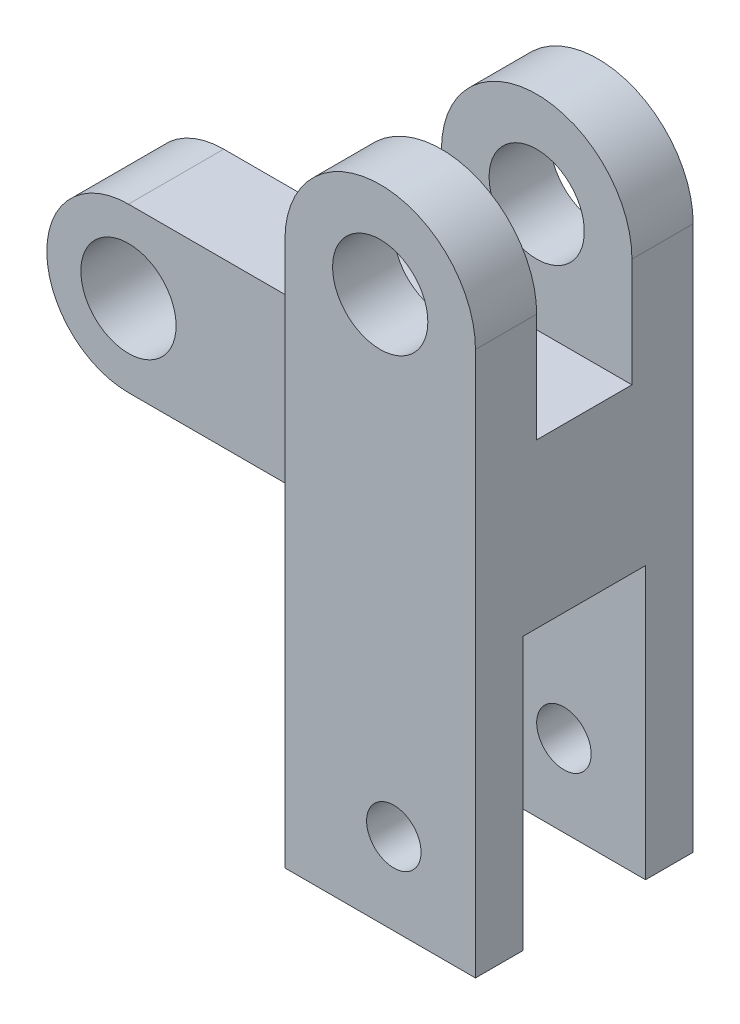
ISO-10303-21;
HEADER;
FILE_DESCRIPTION(('STEP AP214'),'2;1');
FILE_NAME('part.step','',(''),(''),'','','');
FILE_SCHEMA(('AUTOMOTIVE_DESIGN { 1 0 10303 214 1 1 1 1 }'));
ENDSEC;
DATA;
#1=APPLICATION_CONTEXT('core data for automotive mechanical design processes');
#2=APPLICATION_PROTOCOL_DEFINITION('international standard','automotive_design',2000,#1);
#3=PRODUCT_CONTEXT('',#1,'mechanical');
#4=PRODUCT('Part','Part','',(#3));
#5=PRODUCT_RELATED_PRODUCT_CATEGORY('part','',(#4));
#6=PRODUCT_DEFINITION_FORMATION('','',#4);
#7=PRODUCT_DEFINITION_CONTEXT('part definition',#1,'design');
#8=PRODUCT_DEFINITION('design','',#6,#7);
#9=PRODUCT_DEFINITION_SHAPE('','',#8);
#10=(LENGTH_UNIT() NAMED_UNIT(*) SI_UNIT(.MILLI.,.METRE.));
#11=(NAMED_UNIT(*) PLANE_ANGLE_UNIT() SI_UNIT($,.RADIAN.));
#12=(NAMED_UNIT(*) SI_UNIT($,.STERADIAN.) SOLID_ANGLE_UNIT());
#13=UNCERTAINTY_MEASURE_WITH_UNIT(LENGTH_MEASURE(1.E-05),#10,'distance_accuracy_value','');
#14=(GEOMETRIC_REPRESENTATION_CONTEXT(3) GLOBAL_UNCERTAINTY_ASSIGNED_CONTEXT((#13)) GLOBAL_UNIT_ASSIGNED_CONTEXT((#10,
#11,#12)) REPRESENTATION_CONTEXT('',''));
#15=CARTESIAN_POINT('',(0.,0.,0.));
#16=DIRECTION('',(0.,0.,1.));
#17=DIRECTION('',(1.,0.,0.));
#18=AXIS2_PLACEMENT_3D('',#15,#16,#17);
#19=CARTESIAN_POINT('',(0.,2.4,-3.5));
#20=DIRECTION('',(1.,0.,0.));
#21=DIRECTION('',(0.,0.,-1.));
#22=AXIS2_PLACEMENT_3D('',#19,#20,#21);
#23=PLANE('',#22);
#24=DIRECTION('',(0.,-1.,0.));
#25=VECTOR('',#24,1.);
#26=CARTESIAN_POINT('',(0.,3.,2.25));
#27=LINE('',#26,#25);
#28=CARTESIAN_POINT('',(0.,3.,2.25));
#29=VERTEX_POINT('',#28);
#30=CARTESIAN_POINT('',(0.,-7.,2.25));
#31=VERTEX_POINT('',#30);
#32=EDGE_CURVE('E224',#29,#31,#27,.T.);
#33=ORIENTED_EDGE('',*,*,#32,.T.);
#34=DIRECTION('',(0.,0.,-1.));
#35=VECTOR('',#34,1.);
#36=CARTESIAN_POINT('',(0.,-7.,3.5));
#37=LINE('',#36,#35);
#38=CARTESIAN_POINT('',(0.,-7.,4.));
#39=VERTEX_POINT('',#38);
#40=EDGE_CURVE('E264',#39,#31,#37,.T.);
#41=ORIENTED_EDGE('',*,*,#40,.F.);
#42=DIRECTION('',(0.,-1.,0.));
#43=VECTOR('',#42,1.);
#44=CARTESIAN_POINT('',(0.,13.,4.));
#45=LINE('',#44,#43);
#46=CARTESIAN_POINT('',(0.,13.,4.));
#47=VERTEX_POINT('',#46);
#48=EDGE_CURVE('E206',#47,#39,#45,.T.);
#49=ORIENTED_EDGE('',*,*,#48,.F.);
#50=DIRECTION('',(0.,0.,1.));
#51=VECTOR('',#50,1.);
#52=CARTESIAN_POINT('',(0.,13.,1.75));
#53=LINE('',#52,#51);
#54=CARTESIAN_POINT('',(0.,13.,1.75));
#55=VERTEX_POINT('',#54);
#56=EDGE_CURVE('E280',#55,#47,#53,.T.);
#57=ORIENTED_EDGE('',*,*,#56,.F.);
#58=DIRECTION('',(0.,1.,0.));
#59=VECTOR('',#58,1.);
#60=CARTESIAN_POINT('',(0.,0.,1.75));
#61=LINE('',#60,#59);
#62=CARTESIAN_POINT('',(0.,9.,1.75));
#63=VERTEX_POINT('',#62);
#64=EDGE_CURVE('E271',#63,#55,#61,.T.);
#65=ORIENTED_EDGE('',*,*,#64,.F.);
#66=CARTESIAN_POINT('',(0.,3.,1.75));
#67=VERTEX_POINT('',#66);
#68=EDGE_CURVE('E273',#67,#63,#61,.T.);
#69=ORIENTED_EDGE('',*,*,#68,.F.);
#70=DIRECTION('',(0.,0.,1.));
#71=VECTOR('',#70,1.);
#72=CARTESIAN_POINT('',(0.,3.,2.25));
#73=LINE('',#72,#71);
#74=EDGE_CURVE('E213',#67,#29,#73,.T.);
#75=ORIENTED_EDGE('',*,*,#74,.T.);
#76=EDGE_LOOP('',(#33,#41,#49,#57,#65,#69,#75));
#77=FACE_BOUND('',#76,.T.);
#78=ADVANCED_FACE('F45',(#77),#23,.F.);
#79=DIRECTION('',(0.,-1.,0.));
#80=VECTOR('',#79,1.);
#81=CARTESIAN_POINT('',(0.,3.,-2.25));
#82=LINE('',#81,#80);
#83=CARTESIAN_POINT('',(0.,3.,-2.25));
#84=VERTEX_POINT('',#83);
#85=CARTESIAN_POINT('',(0.,-7.,-2.25));
#86=VERTEX_POINT('',#85);
#87=EDGE_CURVE('E61',#84,#86,#82,.T.);
#88=ORIENTED_EDGE('',*,*,#87,.F.);
#89=CARTESIAN_POINT('',(0.,3.,-1.75));
#90=VERTEX_POINT('',#89);
#91=EDGE_CURVE('E210',#84,#90,#73,.T.);
#92=ORIENTED_EDGE('',*,*,#91,.T.);
#93=DIRECTION('',(0.,1.,0.));
#94=VECTOR('',#93,1.);
#95=CARTESIAN_POINT('',(0.,0.,-1.75));
#96=LINE('',#95,#94);
#97=CARTESIAN_POINT('',(0.,9.,-1.75));
#98=VERTEX_POINT('',#97);
#99=EDGE_CURVE('E284',#90,#98,#96,.T.);
#100=ORIENTED_EDGE('',*,*,#99,.T.);
#101=CARTESIAN_POINT('',(0.,13.,-1.75));
#102=VERTEX_POINT('',#101);
#103=EDGE_CURVE('E282',#98,#102,#96,.T.);
#104=ORIENTED_EDGE('',*,*,#103,.T.);
#105=DIRECTION('',(0.,0.,-1.));
#106=VECTOR('',#105,1.);
#107=CARTESIAN_POINT('',(0.,13.,-1.75));
#108=LINE('',#107,#106);
#109=CARTESIAN_POINT('',(0.,13.,-4.));
#110=VERTEX_POINT('',#109);
#111=EDGE_CURVE('E164',#102,#110,#108,.T.);
#112=ORIENTED_EDGE('',*,*,#111,.T.);
#113=DIRECTION('',(0.,1.,0.));
#114=VECTOR('',#113,1.);
#115=CARTESIAN_POINT('',(0.,-7.,-4.));
#116=LINE('',#115,#114);
#117=CARTESIAN_POINT('',(0.,-7.,-4.));
#118=VERTEX_POINT('',#117);
#119=EDGE_CURVE('E181',#118,#110,#116,.T.);
#120=ORIENTED_EDGE('',*,*,#119,.F.);
#121=EDGE_CURVE('E263',#86,#118,#37,.T.);
#122=ORIENTED_EDGE('',*,*,#121,.F.);
#123=EDGE_LOOP('',(#88,#92,#100,#104,#112,#120,#122));
#124=FACE_BOUND('',#123,.T.);
#125=ADVANCED_FACE('F356',(#124),#23,.F.);
#126=CARTESIAN_POINT('',(7.,2.4,-3.5));
#127=DIRECTION('',(-1.,0.,0.));
#128=DIRECTION('',(0.,0.,1.));
#129=AXIS2_PLACEMENT_3D('',#126,#127,#128);
#130=PLANE('',#129);
#131=DIRECTION('',(0.,-1.,0.));
#132=VECTOR('',#131,1.);
#133=CARTESIAN_POINT('',(7.,3.,-2.25));
#134=LINE('',#133,#132);
#135=CARTESIAN_POINT('',(7.,3.,-2.25));
#136=VERTEX_POINT('',#135);
#137=CARTESIAN_POINT('',(7.,-7.,-2.25));
#138=VERTEX_POINT('',#137);
#139=EDGE_CURVE('E221',#136,#138,#134,.T.);
#140=ORIENTED_EDGE('',*,*,#139,.T.);
#141=DIRECTION('',(0.,0.,1.));
#142=VECTOR('',#141,1.);
#143=CARTESIAN_POINT('',(7.,-7.,-3.5));
#144=LINE('',#143,#142);
#145=CARTESIAN_POINT('',(7.,-7.,-4.));
#146=VERTEX_POINT('',#145);
#147=EDGE_CURVE('E171',#146,#138,#144,.T.);
#148=ORIENTED_EDGE('',*,*,#147,.F.);
#149=DIRECTION('',(0.,-1.,0.));
#150=VECTOR('',#149,1.);
#151=CARTESIAN_POINT('',(7.,13.,-4.));
#152=LINE('',#151,#150);
#153=CARTESIAN_POINT('',(7.,13.,-4.));
#154=VERTEX_POINT('',#153);
#155=EDGE_CURVE('E167',#154,#146,#152,.T.);
#156=ORIENTED_EDGE('',*,*,#155,.F.);
#157=DIRECTION('',(0.,0.,-1.));
#158=VECTOR('',#157,1.);
#159=CARTESIAN_POINT('',(7.,13.,-1.75));
#160=LINE('',#159,#158);
#161=CARTESIAN_POINT('',(7.,13.,-1.75));
#162=VERTEX_POINT('',#161);
#163=EDGE_CURVE('E53',#162,#154,#160,.T.);
#164=ORIENTED_EDGE('',*,*,#163,.F.);
#165=DIRECTION('',(0.,-1.,0.));
#166=VECTOR('',#165,1.);
#167=CARTESIAN_POINT('',(7.,0.,-1.75));
#168=LINE('',#167,#166);
#169=CARTESIAN_POINT('',(7.,9.,-1.75));
#170=VERTEX_POINT('',#169);
#171=EDGE_CURVE('E286',#162,#170,#168,.T.);
#172=ORIENTED_EDGE('',*,*,#171,.T.);
#173=DIRECTION('',(0.,0.,-1.));
#174=VECTOR('',#173,1.);
#175=CARTESIAN_POINT('',(7.,9.,1.75));
#176=LINE('',#175,#174);
#177=CARTESIAN_POINT('',(7.,9.,1.75));
#178=VERTEX_POINT('',#177);
#179=EDGE_CURVE('E255',#178,#170,#176,.T.);
#180=ORIENTED_EDGE('',*,*,#179,.F.);
#181=DIRECTION('',(0.,-1.,0.));
#182=VECTOR('',#181,1.);
#183=CARTESIAN_POINT('',(7.,0.,1.75));
#184=LINE('',#183,#182);
#185=CARTESIAN_POINT('',(7.,13.,1.75));
#186=VERTEX_POINT('',#185);
#187=EDGE_CURVE('E276',#186,#178,#184,.T.);
#188=ORIENTED_EDGE('',*,*,#187,.F.);
#189=DIRECTION('',(0.,0.,1.));
#190=VECTOR('',#189,1.);
#191=CARTESIAN_POINT('',(7.,13.,1.75));
#192=LINE('',#191,#190);
#193=CARTESIAN_POINT('',(7.,13.,4.));
#194=VERTEX_POINT('',#193);
#195=EDGE_CURVE('E278',#186,#194,#192,.T.);
#196=ORIENTED_EDGE('',*,*,#195,.T.);
#197=DIRECTION('',(0.,1.,0.));
#198=VECTOR('',#197,1.);
#199=CARTESIAN_POINT('',(7.,-7.,4.));
#200=LINE('',#199,#198);
#201=CARTESIAN_POINT('',(7.,-7.,4.));
#202=VERTEX_POINT('',#201);
#203=EDGE_CURVE('E200',#202,#194,#200,.T.);
#204=ORIENTED_EDGE('',*,*,#203,.F.);
#205=CARTESIAN_POINT('',(7.,-7.,2.25));
#206=VERTEX_POINT('',#205);
#207=EDGE_CURVE('E261',#206,#202,#144,.T.);
#208=ORIENTED_EDGE('',*,*,#207,.F.);
#209=DIRECTION('',(0.,-1.,0.));
#210=VECTOR('',#209,1.);
#211=CARTESIAN_POINT('',(7.,3.,2.25));
#212=LINE('',#211,#210);
#213=CARTESIAN_POINT('',(7.,3.,2.25));
#214=VERTEX_POINT('',#213);
#215=EDGE_CURVE('E69',#214,#206,#212,.T.);
#216=ORIENTED_EDGE('',*,*,#215,.F.);
#217=DIRECTION('',(0.,0.,-1.));
#218=VECTOR('',#217,1.);
#219=CARTESIAN_POINT('',(7.,3.,1.75));
#220=LINE('',#219,#218);
#221=EDGE_CURVE('E257',#214,#136,#220,.T.);
#222=ORIENTED_EDGE('',*,*,#221,.T.);
#223=EDGE_LOOP('',(#140,#148,#156,#164,#172,#180,#188,#196,#204,#208,#216,#222));
#224=FACE_BOUND('',#223,.T.);
#225=ADVANCED_FACE('F169',(#224),#130,.F.);
#226=CARTESIAN_POINT('',(0.,-7.,0.));
#227=DIRECTION('',(0.,-1.,0.));
#228=DIRECTION('',(0.,0.,-1.));
#229=AXIS2_PLACEMENT_3D('',#226,#227,#228);
#230=PLANE('',#229);
#231=ORIENTED_EDGE('',*,*,#40,.T.);
#232=DIRECTION('',(1.,0.,0.));
#233=VECTOR('',#232,1.);
#234=CARTESIAN_POINT('',(0.,-7.,2.25));
#235=LINE('',#234,#233);
#236=EDGE_CURVE('E209',#31,#206,#235,.T.);
#237=ORIENTED_EDGE('',*,*,#236,.T.);
#238=ORIENTED_EDGE('',*,*,#207,.T.);
#239=DIRECTION('',(1.,0.,0.));
#240=VECTOR('',#239,1.);
#241=CARTESIAN_POINT('',(0.,-7.,4.));
#242=LINE('',#241,#240);
#243=EDGE_CURVE('E197',#39,#202,#242,.T.);
#244=ORIENTED_EDGE('',*,*,#243,.F.);
#245=EDGE_LOOP('',(#231,#237,#238,#244));
#246=FACE_BOUND('',#245,.T.);
#247=ADVANCED_FACE('F312',(#246),#230,.T.);
#248=ORIENTED_EDGE('',*,*,#147,.T.);
#249=DIRECTION('',(-1.,0.,0.));
#250=VECTOR('',#249,1.);
#251=CARTESIAN_POINT('',(0.,-7.,-2.25));
#252=LINE('',#251,#250);
#253=EDGE_CURVE('E218',#138,#86,#252,.T.);
#254=ORIENTED_EDGE('',*,*,#253,.T.);
#255=ORIENTED_EDGE('',*,*,#121,.T.);
#256=DIRECTION('',(-1.,0.,0.));
#257=VECTOR('',#256,1.);
#258=CARTESIAN_POINT('',(7.,-7.,-4.));
#259=LINE('',#258,#257);
#260=EDGE_CURVE('E175',#146,#118,#259,.T.);
#261=ORIENTED_EDGE('',*,*,#260,.F.);
#262=EDGE_LOOP('',(#248,#254,#255,#261));
#263=FACE_BOUND('',#262,.T.);
#264=ADVANCED_FACE('F358',(#263),#230,.T.);
#265=CARTESIAN_POINT('',(4.,-4.,-3.5));
#266=DIRECTION('',(0.,0.,1.));
#267=DIRECTION('',(1.,0.,0.));
#268=AXIS2_PLACEMENT_3D('',#265,#266,#267);
#269=CYLINDRICAL_SURFACE('',#268,1.);
#270=CARTESIAN_POINT('',(4.,-4.,2.25));
#271=DIRECTION('',(0.,0.,-1.));
#272=DIRECTION('',(-1.,0.,0.));
#273=AXIS2_PLACEMENT_3D('',#270,#271,#272);
#274=CIRCLE('',#273,1.);
#275=CARTESIAN_POINT('',(3.,-4.,2.25));
#276=VERTEX_POINT('',#275);
#277=EDGE_CURVE('E48',#276,#276,#274,.T.);
#278=ORIENTED_EDGE('',*,*,#277,.T.);
#279=EDGE_LOOP('',(#278));
#280=FACE_BOUND('',#279,.T.);
#281=CARTESIAN_POINT('',(4.,-4.,4.));
#282=DIRECTION('',(0.,0.,1.));
#283=DIRECTION('',(1.,0.,0.));
#284=AXIS2_PLACEMENT_3D('',#281,#282,#283);
#285=CIRCLE('',#284,1.);
#286=CARTESIAN_POINT('',(5.,-4.,4.));
#287=VERTEX_POINT('',#286);
#288=EDGE_CURVE('E194',#287,#287,#285,.T.);
#289=ORIENTED_EDGE('',*,*,#288,.T.);
#290=EDGE_LOOP('',(#289));
#291=FACE_BOUND('',#290,.T.);
#292=ADVANCED_FACE('F296',(#280,#291),#269,.F.);
#293=CARTESIAN_POINT('',(4.,-4.,-2.25));
#294=DIRECTION('',(0.,0.,1.));
#295=DIRECTION('',(1.,0.,0.));
#296=AXIS2_PLACEMENT_3D('',#293,#294,#295);
#297=CIRCLE('',#296,1.);
#298=CARTESIAN_POINT('',(5.,-4.,-2.25));
#299=VERTEX_POINT('',#298);
#300=EDGE_CURVE('E227',#299,#299,#297,.T.);
#301=ORIENTED_EDGE('',*,*,#300,.T.);
#302=EDGE_LOOP('',(#301));
#303=FACE_BOUND('',#302,.T.);
#304=CARTESIAN_POINT('',(4.,-4.,-4.));
#305=DIRECTION('',(0.,0.,-1.));
#306=DIRECTION('',(-1.,0.,0.));
#307=AXIS2_PLACEMENT_3D('',#304,#305,#306);
#308=CIRCLE('',#307,0.999999999999997);
#309=CARTESIAN_POINT('',(3.,-4.,-4.));
#310=VERTEX_POINT('',#309);
#311=EDGE_CURVE('E182',#310,#310,#308,.T.);
#312=ORIENTED_EDGE('',*,*,#311,.T.);
#313=EDGE_LOOP('',(#312));
#314=FACE_BOUND('',#313,.T.);
#315=ADVANCED_FACE('F366',(#303,#314),#269,.F.);
#316=CARTESIAN_POINT('',(3.5,13.,-1.75));
#317=DIRECTION('',(0.,0.,-1.));
#318=DIRECTION('',(-1.,0.,0.));
#319=AXIS2_PLACEMENT_3D('',#316,#317,#318);
#320=CYLINDRICAL_SURFACE('',#319,3.5);
#321=ORIENTED_EDGE('',*,*,#163,.T.);
#322=CARTESIAN_POINT('',(3.5,13.,-4.));
#323=DIRECTION('',(0.,0.,-1.));
#324=DIRECTION('',(-1.,0.,0.));
#325=AXIS2_PLACEMENT_3D('',#322,#323,#324);
#326=CIRCLE('',#325,3.5);
#327=EDGE_CURVE('E158',#110,#154,#326,.T.);
#328=ORIENTED_EDGE('',*,*,#327,.F.);
#329=ORIENTED_EDGE('',*,*,#111,.F.);
#330=CARTESIAN_POINT('',(3.5,13.,-1.75));
#331=DIRECTION('',(0.,0.,-1.));
#332=DIRECTION('',(-1.,0.,0.));
#333=AXIS2_PLACEMENT_3D('',#330,#331,#332);
#334=CIRCLE('',#333,3.5);
#335=EDGE_CURVE('E160',#102,#162,#334,.T.);
#336=ORIENTED_EDGE('',*,*,#335,.T.);
#337=EDGE_LOOP('',(#321,#328,#329,#336));
#338=FACE_BOUND('',#337,.T.);
#339=ADVANCED_FACE('F155',(#338),#320,.T.);
#340=CARTESIAN_POINT('',(0.,0.,-1.75));
#341=DIRECTION('',(0.,0.,-1.));
#342=DIRECTION('',(-1.,0.,0.));
#343=AXIS2_PLACEMENT_3D('',#340,#341,#342);
#344=PLANE('',#343);
#345=CARTESIAN_POINT('',(3.5,13.,-1.75));
#346=DIRECTION('',(0.,0.,-1.));
#347=DIRECTION('',(-1.,0.,0.));
#348=AXIS2_PLACEMENT_3D('',#345,#346,#347);
#349=CIRCLE('',#348,1.75);
#350=CARTESIAN_POINT('',(1.75,13.,-1.75));
#351=VERTEX_POINT('',#350);
#352=EDGE_CURVE('E268',#351,#351,#349,.T.);
#353=ORIENTED_EDGE('',*,*,#352,.T.);
#354=EDGE_LOOP('',(#353));
#355=FACE_BOUND('',#354,.T.);
#356=ORIENTED_EDGE('',*,*,#103,.F.);
#357=DIRECTION('',(1.,0.,0.));
#358=VECTOR('',#357,1.);
#359=CARTESIAN_POINT('',(0.,9.,-1.75));
#360=LINE('',#359,#358);
#361=EDGE_CURVE('E251',#98,#170,#360,.T.);
#362=ORIENTED_EDGE('',*,*,#361,.T.);
#363=ORIENTED_EDGE('',*,*,#171,.F.);
#364=ORIENTED_EDGE('',*,*,#335,.F.);
#365=EDGE_LOOP('',(#356,#362,#363,#364));
#366=FACE_BOUND('',#365,.T.);
#367=ADVANCED_FACE('F336',(#355,#366),#344,.F.);
#368=CARTESIAN_POINT('',(3.5,13.,1.75));
#369=DIRECTION('',(0.,0.,1.));
#370=DIRECTION('',(1.,0.,0.));
#371=AXIS2_PLACEMENT_3D('',#368,#369,#370);
#372=CYLINDRICAL_SURFACE('',#371,3.5);
#373=ORIENTED_EDGE('',*,*,#56,.T.);
#374=CARTESIAN_POINT('',(3.5,13.,4.));
#375=DIRECTION('',(0.,0.,1.));
#376=DIRECTION('',(1.,0.,0.));
#377=AXIS2_PLACEMENT_3D('',#374,#375,#376);
#378=CIRCLE('',#377,3.5);
#379=EDGE_CURVE('E203',#194,#47,#378,.T.);
#380=ORIENTED_EDGE('',*,*,#379,.F.);
#381=ORIENTED_EDGE('',*,*,#195,.F.);
#382=CARTESIAN_POINT('',(3.5,13.,1.75));
#383=DIRECTION('',(0.,0.,-1.));
#384=DIRECTION('',(-1.,0.,0.));
#385=AXIS2_PLACEMENT_3D('',#382,#383,#384);
#386=CIRCLE('',#385,3.5);
#387=EDGE_CURVE('E274',#55,#186,#386,.T.);
#388=ORIENTED_EDGE('',*,*,#387,.F.);
#389=EDGE_LOOP('',(#373,#380,#381,#388));
#390=FACE_BOUND('',#389,.T.);
#391=ADVANCED_FACE('F322',(#390),#372,.T.);
#392=CARTESIAN_POINT('',(0.,0.,1.75));
#393=DIRECTION('',(0.,0.,-1.));
#394=DIRECTION('',(-1.,0.,0.));
#395=AXIS2_PLACEMENT_3D('',#392,#393,#394);
#396=PLANE('',#395);
#397=DIRECTION('',(1.,0.,0.));
#398=VECTOR('',#397,1.);
#399=CARTESIAN_POINT('',(0.,9.,1.75));
#400=LINE('',#399,#398);
#401=EDGE_CURVE('E12',#63,#178,#400,.T.);
#402=ORIENTED_EDGE('',*,*,#401,.F.);
#403=ORIENTED_EDGE('',*,*,#64,.T.);
#404=ORIENTED_EDGE('',*,*,#387,.T.);
#405=ORIENTED_EDGE('',*,*,#187,.T.);
#406=EDGE_LOOP('',(#402,#403,#404,#405));
#407=FACE_BOUND('',#406,.T.);
#408=CARTESIAN_POINT('',(3.5,13.,1.75));
#409=DIRECTION('',(0.,0.,-1.));
#410=DIRECTION('',(-1.,0.,0.));
#411=AXIS2_PLACEMENT_3D('',#408,#409,#410);
#412=CIRCLE('',#411,1.75);
#413=CARTESIAN_POINT('',(1.75,13.,1.75));
#414=VERTEX_POINT('',#413);
#415=EDGE_CURVE('E267',#414,#414,#412,.T.);
#416=ORIENTED_EDGE('',*,*,#415,.F.);
#417=EDGE_LOOP('',(#416));
#418=FACE_BOUND('',#417,.T.);
#419=ADVANCED_FACE('F326',(#407,#418),#396,.T.);
#420=CARTESIAN_POINT('',(3.5,13.,3.5));
#421=DIRECTION('',(0.,0.,-1.));
#422=DIRECTION('',(-1.,0.,0.));
#423=AXIS2_PLACEMENT_3D('',#420,#421,#422);
#424=CYLINDRICAL_SURFACE('',#423,1.75);
#425=ORIENTED_EDGE('',*,*,#415,.T.);
#426=EDGE_LOOP('',(#425));
#427=FACE_BOUND('',#426,.T.);
#428=CARTESIAN_POINT('',(3.5,13.,4.));
#429=DIRECTION('',(0.,0.,1.));
#430=DIRECTION('',(1.,0.,0.));
#431=AXIS2_PLACEMENT_3D('',#428,#429,#430);
#432=CIRCLE('',#431,1.75);
#433=CARTESIAN_POINT('',(5.25,13.,4.));
#434=VERTEX_POINT('',#433);
#435=EDGE_CURVE('E191',#434,#434,#432,.T.);
#436=ORIENTED_EDGE('',*,*,#435,.T.);
#437=EDGE_LOOP('',(#436));
#438=FACE_BOUND('',#437,.T.);
#439=ADVANCED_FACE('F389',(#427,#438),#424,.F.);
#440=ORIENTED_EDGE('',*,*,#352,.F.);
#441=EDGE_LOOP('',(#440));
#442=FACE_BOUND('',#441,.T.);
#443=CARTESIAN_POINT('',(3.5,13.,-4.));
#444=DIRECTION('',(0.,0.,-1.));
#445=DIRECTION('',(-1.,0.,0.));
#446=AXIS2_PLACEMENT_3D('',#443,#444,#445);
#447=CIRCLE('',#446,1.75);
#448=CARTESIAN_POINT('',(1.75,13.,-4.));
#449=VERTEX_POINT('',#448);
#450=EDGE_CURVE('E185',#449,#449,#447,.T.);
#451=ORIENTED_EDGE('',*,*,#450,.T.);
#452=EDGE_LOOP('',(#451));
#453=FACE_BOUND('',#452,.T.);
#454=ADVANCED_FACE('F391',(#442,#453),#424,.F.);
#455=CARTESIAN_POINT('',(0.,0.,1.75));
#456=DIRECTION('',(0.,0.,1.));
#457=DIRECTION('',(1.,0.,0.));
#458=AXIS2_PLACEMENT_3D('',#455,#456,#457);
#459=PLANE('',#458);
#460=CARTESIAN_POINT('',(-8.,6.,1.75));
#461=DIRECTION('',(0.,0.,1.));
#462=DIRECTION('',(1.,0.,0.));
#463=AXIS2_PLACEMENT_3D('',#460,#461,#462);
#464=CIRCLE('',#463,1.75);
#465=CARTESIAN_POINT('',(-6.25,6.,1.75));
#466=VERTEX_POINT('',#465);
#467=EDGE_CURVE('E228',#466,#466,#464,.T.);
#468=ORIENTED_EDGE('',*,*,#467,.F.);
#469=EDGE_LOOP('',(#468));
#470=FACE_BOUND('',#469,.T.);
#471=ORIENTED_EDGE('',*,*,#68,.T.);
#472=DIRECTION('',(1.,0.,0.));
#473=VECTOR('',#472,1.);
#474=CARTESIAN_POINT('',(0.,9.,1.75));
#475=LINE('',#474,#473);
#476=CARTESIAN_POINT('',(-8.,9.,1.75));
#477=VERTEX_POINT('',#476);
#478=EDGE_CURVE('E238',#477,#63,#475,.T.);
#479=ORIENTED_EDGE('',*,*,#478,.F.);
#480=CARTESIAN_POINT('',(-8.,6.,1.75));
#481=DIRECTION('',(0.,0.,1.));
#482=DIRECTION('',(1.,0.,0.));
#483=AXIS2_PLACEMENT_3D('',#480,#481,#482);
#484=CIRCLE('',#483,3.);
#485=CARTESIAN_POINT('',(-8.,3.,1.75));
#486=VERTEX_POINT('',#485);
#487=EDGE_CURVE('E231',#486,#477,#484,.F.);
#488=ORIENTED_EDGE('',*,*,#487,.F.);
#489=DIRECTION('',(1.,0.,0.));
#490=VECTOR('',#489,1.);
#491=CARTESIAN_POINT('',(0.,3.,1.75));
#492=LINE('',#491,#490);
#493=EDGE_CURVE('E235',#486,#67,#492,.T.);
#494=ORIENTED_EDGE('',*,*,#493,.T.);
#495=EDGE_LOOP('',(#471,#479,#488,#494));
#496=FACE_BOUND('',#495,.T.);
#497=ADVANCED_FACE('F348',(#470,#496),#459,.T.);
#498=CARTESIAN_POINT('',(0.,0.,-1.75));
#499=DIRECTION('',(0.,0.,1.));
#500=DIRECTION('',(1.,0.,0.));
#501=AXIS2_PLACEMENT_3D('',#498,#499,#500);
#502=PLANE('',#501);
#503=CARTESIAN_POINT('',(-8.,6.,-1.75));
#504=DIRECTION('',(0.,0.,1.));
#505=DIRECTION('',(1.,0.,0.));
#506=AXIS2_PLACEMENT_3D('',#503,#504,#505);
#507=CIRCLE('',#506,1.75);
#508=CARTESIAN_POINT('',(-6.25,6.,-1.75));
#509=VERTEX_POINT('',#508);
#510=EDGE_CURVE('E242',#509,#509,#507,.T.);
#511=ORIENTED_EDGE('',*,*,#510,.T.);
#512=EDGE_LOOP('',(#511));
#513=FACE_BOUND('',#512,.T.);
#514=CARTESIAN_POINT('',(-8.,9.,-1.75));
#515=VERTEX_POINT('',#514);
#516=EDGE_CURVE('E232',#515,#98,#360,.T.);
#517=ORIENTED_EDGE('',*,*,#516,.T.);
#518=ORIENTED_EDGE('',*,*,#99,.F.);
#519=DIRECTION('',(1.,0.,0.));
#520=VECTOR('',#519,1.);
#521=CARTESIAN_POINT('',(0.,3.,-1.75));
#522=LINE('',#521,#520);
#523=CARTESIAN_POINT('',(-8.,3.,-1.75));
#524=VERTEX_POINT('',#523);
#525=EDGE_CURVE('E248',#524,#90,#522,.T.);
#526=ORIENTED_EDGE('',*,*,#525,.F.);
#527=CARTESIAN_POINT('',(-8.,6.,-1.75));
#528=DIRECTION('',(0.,0.,1.));
#529=DIRECTION('',(1.,0.,0.));
#530=AXIS2_PLACEMENT_3D('',#527,#528,#529);
#531=CIRCLE('',#530,3.);
#532=EDGE_CURVE('E245',#524,#515,#531,.F.);
#533=ORIENTED_EDGE('',*,*,#532,.T.);
#534=EDGE_LOOP('',(#517,#518,#526,#533));
#535=FACE_BOUND('',#534,.T.);
#536=ADVANCED_FACE('F340',(#513,#535),#502,.F.);
#537=CARTESIAN_POINT('',(-8.,6.,1.75));
#538=DIRECTION('',(0.,0.,-1.));
#539=DIRECTION('',(-1.,0.,0.));
#540=AXIS2_PLACEMENT_3D('',#537,#538,#539);
#541=CYLINDRICAL_SURFACE('',#540,3.);
#542=ORIENTED_EDGE('',*,*,#532,.F.);
#543=DIRECTION('',(0.,0.,-1.));
#544=VECTOR('',#543,1.);
#545=CARTESIAN_POINT('',(-8.,3.,1.75));
#546=LINE('',#545,#544);
#547=EDGE_CURVE('E259',#486,#524,#546,.T.);
#548=ORIENTED_EDGE('',*,*,#547,.F.);
#549=ORIENTED_EDGE('',*,*,#487,.T.);
#550=DIRECTION('',(0.,0.,-1.));
#551=VECTOR('',#550,1.);
#552=CARTESIAN_POINT('',(-8.,9.,1.75));
#553=LINE('',#552,#551);
#554=EDGE_CURVE('E241',#477,#515,#553,.T.);
#555=ORIENTED_EDGE('',*,*,#554,.T.);
#556=EDGE_LOOP('',(#542,#548,#549,#555));
#557=FACE_BOUND('',#556,.T.);
#558=ADVANCED_FACE('F344',(#557),#541,.T.);
#559=CARTESIAN_POINT('',(0.,3.,1.75));
#560=DIRECTION('',(0.,1.,0.));
#561=DIRECTION('',(-1.,0.,0.));
#562=AXIS2_PLACEMENT_3D('',#559,#560,#561);
#563=PLANE('',#562);
#564=ORIENTED_EDGE('',*,*,#221,.F.);
#565=DIRECTION('',(1.,0.,0.));
#566=VECTOR('',#565,1.);
#567=CARTESIAN_POINT('',(0.,3.,2.25));
#568=LINE('',#567,#566);
#569=EDGE_CURVE('E212',#29,#214,#568,.T.);
#570=ORIENTED_EDGE('',*,*,#569,.F.);
#571=ORIENTED_EDGE('',*,*,#74,.F.);
#572=ORIENTED_EDGE('',*,*,#493,.F.);
#573=ORIENTED_EDGE('',*,*,#547,.T.);
#574=ORIENTED_EDGE('',*,*,#525,.T.);
#575=ORIENTED_EDGE('',*,*,#91,.F.);
#576=DIRECTION('',(-1.,0.,0.));
#577=VECTOR('',#576,1.);
#578=CARTESIAN_POINT('',(0.,3.,-2.25));
#579=LINE('',#578,#577);
#580=EDGE_CURVE('E215',#136,#84,#579,.T.);
#581=ORIENTED_EDGE('',*,*,#580,.F.);
#582=EDGE_LOOP('',(#564,#570,#571,#572,#573,#574,#575,#581));
#583=FACE_BOUND('',#582,.T.);
#584=ADVANCED_FACE('F350',(#583),#563,.F.);
#585=CARTESIAN_POINT('',(-8.,6.,1.75));
#586=DIRECTION('',(0.,0.,-1.));
#587=DIRECTION('',(-1.,0.,0.));
#588=AXIS2_PLACEMENT_3D('',#585,#586,#587);
#589=CYLINDRICAL_SURFACE('',#588,1.75);
#590=ORIENTED_EDGE('',*,*,#467,.T.);
#591=EDGE_LOOP('',(#590));
#592=FACE_BOUND('',#591,.T.);
#593=ORIENTED_EDGE('',*,*,#510,.F.);
#594=EDGE_LOOP('',(#593));
#595=FACE_BOUND('',#594,.T.);
#596=ADVANCED_FACE('F420',(#592,#595),#589,.F.);
#597=CARTESIAN_POINT('',(0.,9.,1.75));
#598=DIRECTION('',(0.,1.,0.));
#599=DIRECTION('',(0.,0.,1.));
#600=AXIS2_PLACEMENT_3D('',#597,#598,#599);
#601=PLANE('',#600);
#602=ORIENTED_EDGE('',*,*,#516,.F.);
#603=ORIENTED_EDGE('',*,*,#554,.F.);
#604=ORIENTED_EDGE('',*,*,#478,.T.);
#605=ORIENTED_EDGE('',*,*,#401,.T.);
#606=ORIENTED_EDGE('',*,*,#179,.T.);
#607=ORIENTED_EDGE('',*,*,#361,.F.);
#608=EDGE_LOOP('',(#602,#603,#604,#605,#606,#607));
#609=FACE_BOUND('',#608,.T.);
#610=ADVANCED_FACE('F331',(#609),#601,.T.);
#611=CARTESIAN_POINT('',(0.,3.,-2.25));
#612=DIRECTION('',(0.,0.,1.));
#613=DIRECTION('',(1.,0.,0.));
#614=AXIS2_PLACEMENT_3D('',#611,#612,#613);
#615=PLANE('',#614);
#616=ORIENTED_EDGE('',*,*,#300,.F.);
#617=EDGE_LOOP('',(#616));
#618=FACE_BOUND('',#617,.T.);
#619=ORIENTED_EDGE('',*,*,#253,.F.);
#620=ORIENTED_EDGE('',*,*,#139,.F.);
#621=ORIENTED_EDGE('',*,*,#580,.T.);
#622=ORIENTED_EDGE('',*,*,#87,.T.);
#623=EDGE_LOOP('',(#619,#620,#621,#622));
#624=FACE_BOUND('',#623,.T.);
#625=ADVANCED_FACE('F302',(#618,#624),#615,.T.);
#626=CARTESIAN_POINT('',(0.,3.,2.25));
#627=DIRECTION('',(0.,0.,-1.));
#628=DIRECTION('',(-1.,0.,0.));
#629=AXIS2_PLACEMENT_3D('',#626,#627,#628);
#630=PLANE('',#629);
#631=ORIENTED_EDGE('',*,*,#277,.F.);
#632=EDGE_LOOP('',(#631));
#633=FACE_BOUND('',#632,.T.);
#634=ORIENTED_EDGE('',*,*,#236,.F.);
#635=ORIENTED_EDGE('',*,*,#32,.F.);
#636=ORIENTED_EDGE('',*,*,#569,.T.);
#637=ORIENTED_EDGE('',*,*,#215,.T.);
#638=EDGE_LOOP('',(#634,#635,#636,#637));
#639=FACE_BOUND('',#638,.T.);
#640=ADVANCED_FACE('F299',(#633,#639),#630,.T.);
#641=CARTESIAN_POINT('',(3.5,13.,4.));
#642=DIRECTION('',(0.,0.,1.));
#643=DIRECTION('',(1.,0.,0.));
#644=AXIS2_PLACEMENT_3D('',#641,#642,#643);
#645=PLANE('',#644);
#646=ORIENTED_EDGE('',*,*,#288,.F.);
#647=EDGE_LOOP('',(#646));
#648=FACE_BOUND('',#647,.T.);
#649=ORIENTED_EDGE('',*,*,#243,.T.);
#650=ORIENTED_EDGE('',*,*,#203,.T.);
#651=ORIENTED_EDGE('',*,*,#379,.T.);
#652=ORIENTED_EDGE('',*,*,#48,.T.);
#653=EDGE_LOOP('',(#649,#650,#651,#652));
#654=FACE_BOUND('',#653,.T.);
#655=ORIENTED_EDGE('',*,*,#435,.F.);
#656=EDGE_LOOP('',(#655));
#657=FACE_BOUND('',#656,.T.);
#658=ADVANCED_FACE('F301',(#648,#654,#657),#645,.T.);
#659=CARTESIAN_POINT('',(3.5,13.,-4.));
#660=DIRECTION('',(0.,0.,-1.));
#661=DIRECTION('',(-1.,0.,0.));
#662=AXIS2_PLACEMENT_3D('',#659,#660,#661);
#663=PLANE('',#662);
#664=ORIENTED_EDGE('',*,*,#311,.F.);
#665=EDGE_LOOP('',(#664));
#666=FACE_BOUND('',#665,.T.);
#667=ORIENTED_EDGE('',*,*,#327,.T.);
#668=ORIENTED_EDGE('',*,*,#155,.T.);
#669=ORIENTED_EDGE('',*,*,#260,.T.);
#670=ORIENTED_EDGE('',*,*,#119,.T.);
#671=EDGE_LOOP('',(#667,#668,#669,#670));
#672=FACE_BOUND('',#671,.T.);
#673=ORIENTED_EDGE('',*,*,#450,.F.);
#674=EDGE_LOOP('',(#673));
#675=FACE_BOUND('',#674,.T.);
#676=ADVANCED_FACE('F178',(#666,#672,#675),#663,.T.);
#677=CLOSED_SHELL('',(#78,#125,#225,#247,#264,#292,#315,#339,#367,#391,#419,#439,#454,#497,#536,
#558,#584,#596,#610,#625,#640,#658,#676));
#678=MANIFOLD_SOLID_BREP('B2',#677);
#679=ADVANCED_BREP_SHAPE_REPRESENTATION('',(#18,#678),#14);
#680=SHAPE_DEFINITION_REPRESENTATION(#9,#679);
ENDSEC;
END-ISO-10303-21;
